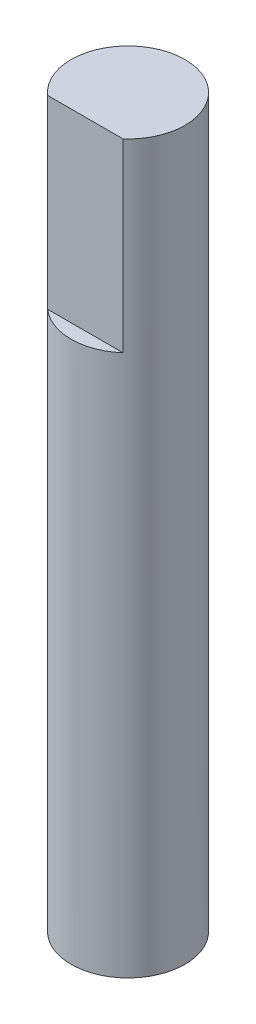
ISO-10303-21;
HEADER;
FILE_DESCRIPTION(('STEP AP214'),'2;1');
FILE_NAME('part.step','',(''),(''),'','','');
FILE_SCHEMA(('AUTOMOTIVE_DESIGN { 1 0 10303 214 1 1 1 1 }'));
ENDSEC;
DATA;
#1=APPLICATION_CONTEXT('core data for automotive mechanical design processes');
#2=APPLICATION_PROTOCOL_DEFINITION('international standard','automotive_design',2000,#1);
#3=PRODUCT_CONTEXT('',#1,'mechanical');
#4=PRODUCT('Part','Part','',(#3));
#5=PRODUCT_RELATED_PRODUCT_CATEGORY('part','',(#4));
#6=PRODUCT_DEFINITION_FORMATION('','',#4);
#7=PRODUCT_DEFINITION_CONTEXT('part definition',#1,'design');
#8=PRODUCT_DEFINITION('design','',#6,#7);
#9=PRODUCT_DEFINITION_SHAPE('','',#8);
#10=(LENGTH_UNIT() NAMED_UNIT(*) SI_UNIT(.MILLI.,.METRE.));
#11=(NAMED_UNIT(*) PLANE_ANGLE_UNIT() SI_UNIT($,.RADIAN.));
#12=(NAMED_UNIT(*) SI_UNIT($,.STERADIAN.) SOLID_ANGLE_UNIT());
#13=UNCERTAINTY_MEASURE_WITH_UNIT(LENGTH_MEASURE(1.E-05),#10,'distance_accuracy_value','');
#14=(GEOMETRIC_REPRESENTATION_CONTEXT(3) GLOBAL_UNCERTAINTY_ASSIGNED_CONTEXT((#13)) GLOBAL_UNIT_ASSIGNED_CONTEXT((#10,
#11,#12)) REPRESENTATION_CONTEXT('',''));
#15=CARTESIAN_POINT('',(0.,0.,0.));
#16=DIRECTION('',(0.,0.,1.));
#17=DIRECTION('',(1.,0.,0.));
#18=AXIS2_PLACEMENT_3D('',#15,#16,#17);
#19=CARTESIAN_POINT('',(0.,13.,0.));
#20=DIRECTION('',(0.,-1.,0.));
#21=DIRECTION('',(0.,0.,-1.));
#22=AXIS2_PLACEMENT_3D('',#19,#20,#21);
#23=CYLINDRICAL_SURFACE('',#22,4.);
#24=DIRECTION('',(0.,-1.,0.));
#25=VECTOR('',#24,1.);
#26=CARTESIAN_POINT('',(2.64575131106459,13.,3.));
#27=LINE('',#26,#25);
#28=CARTESIAN_POINT('',(2.64575131106459,13.,3.));
#29=VERTEX_POINT('',#28);
#30=CARTESIAN_POINT('',(2.64575131106459,0.,3.));
#31=VERTEX_POINT('',#30);
#32=EDGE_CURVE('E41',#29,#31,#27,.T.);
#33=ORIENTED_EDGE('',*,*,#32,.T.);
#34=CARTESIAN_POINT('',(0.,0.,0.));
#35=DIRECTION('',(0.,-1.,0.));
#36=DIRECTION('',(0.,0.,-1.));
#37=AXIS2_PLACEMENT_3D('',#34,#35,#36);
#38=CIRCLE('',#37,4.);
#39=CARTESIAN_POINT('',(-2.64575131106459,0.,3.));
#40=VERTEX_POINT('',#39);
#41=EDGE_CURVE('E58',#31,#40,#38,.T.);
#42=ORIENTED_EDGE('',*,*,#41,.T.);
#43=DIRECTION('',(0.,-1.,0.));
#44=VECTOR('',#43,1.);
#45=CARTESIAN_POINT('',(-2.64575131106459,13.,3.));
#46=LINE('',#45,#44);
#47=CARTESIAN_POINT('',(-2.64575131106459,13.,3.));
#48=VERTEX_POINT('',#47);
#49=EDGE_CURVE('E11',#48,#40,#46,.T.);
#50=ORIENTED_EDGE('',*,*,#49,.F.);
#51=CARTESIAN_POINT('',(0.,13.,0.));
#52=DIRECTION('',(0.,1.,0.));
#53=DIRECTION('',(0.,0.,-1.));
#54=AXIS2_PLACEMENT_3D('',#51,#52,#53);
#55=CIRCLE('',#54,4.);
#56=EDGE_CURVE('E68',#29,#48,#55,.T.);
#57=ORIENTED_EDGE('',*,*,#56,.F.);
#58=EDGE_LOOP('',(#33,#42,#50,#57));
#59=FACE_BOUND('',#58,.T.);
#60=CARTESIAN_POINT('',(0.,-38.,0.));
#61=DIRECTION('',(0.,-1.,0.));
#62=DIRECTION('',(0.,0.,-1.));
#63=AXIS2_PLACEMENT_3D('',#60,#61,#62);
#64=CIRCLE('',#63,4.);
#65=CARTESIAN_POINT('',(0.,-38.,-4.));
#66=VERTEX_POINT('',#65);
#67=EDGE_CURVE('E63',#66,#66,#64,.T.);
#68=ORIENTED_EDGE('',*,*,#67,.F.);
#69=EDGE_LOOP('',(#68));
#70=FACE_BOUND('',#69,.T.);
#71=ADVANCED_FACE('F33',(#59,#70),#23,.T.);
#72=CARTESIAN_POINT('',(-2.64575131106459,13.,3.));
#73=DIRECTION('',(0.,0.,-1.));
#74=DIRECTION('',(-1.,0.,0.));
#75=AXIS2_PLACEMENT_3D('',#72,#73,#74);
#76=PLANE('',#75);
#77=DIRECTION('',(1.,0.,0.));
#78=VECTOR('',#77,1.);
#79=CARTESIAN_POINT('',(-2.64575131106459,0.,3.));
#80=LINE('',#79,#78);
#81=EDGE_CURVE('E56',#40,#31,#80,.T.);
#82=ORIENTED_EDGE('',*,*,#81,.T.);
#83=ORIENTED_EDGE('',*,*,#32,.F.);
#84=DIRECTION('',(1.,0.,0.));
#85=VECTOR('',#84,1.);
#86=CARTESIAN_POINT('',(-2.64575131106459,13.,3.));
#87=LINE('',#86,#85);
#88=EDGE_CURVE('E47',#48,#29,#87,.T.);
#89=ORIENTED_EDGE('',*,*,#88,.F.);
#90=ORIENTED_EDGE('',*,*,#49,.T.);
#91=EDGE_LOOP('',(#82,#83,#89,#90));
#92=FACE_BOUND('',#91,.T.);
#93=ADVANCED_FACE('F66',(#92),#76,.F.);
#94=CARTESIAN_POINT('',(0.,13.,0.));
#95=DIRECTION('',(0.,-1.,0.));
#96=DIRECTION('',(0.,0.,-1.));
#97=AXIS2_PLACEMENT_3D('',#94,#95,#96);
#98=PLANE('',#97);
#99=ORIENTED_EDGE('',*,*,#56,.T.);
#100=ORIENTED_EDGE('',*,*,#88,.T.);
#101=EDGE_LOOP('',(#99,#100));
#102=FACE_BOUND('',#101,.T.);
#103=ADVANCED_FACE('F82',(#102),#98,.F.);
#104=CARTESIAN_POINT('',(0.,-38.,0.));
#105=DIRECTION('',(0.,-1.,0.));
#106=DIRECTION('',(0.,0.,-1.));
#107=AXIS2_PLACEMENT_3D('',#104,#105,#106);
#108=PLANE('',#107);
#109=ORIENTED_EDGE('',*,*,#67,.T.);
#110=EDGE_LOOP('',(#109));
#111=FACE_BOUND('',#110,.T.);
#112=ADVANCED_FACE('F77',(#111),#108,.T.);
#113=CARTESIAN_POINT('',(0.,0.,0.));
#114=DIRECTION('',(0.,-1.,0.));
#115=DIRECTION('',(0.,0.,-1.));
#116=AXIS2_PLACEMENT_3D('',#113,#114,#115);
#117=PLANE('',#116);
#118=ORIENTED_EDGE('',*,*,#81,.F.);
#119=ORIENTED_EDGE('',*,*,#41,.F.);
#120=EDGE_LOOP('',(#118,#119));
#121=FACE_BOUND('',#120,.T.);
#122=ADVANCED_FACE('F59',(#121),#117,.F.);
#123=CLOSED_SHELL('',(#71,#93,#103,#112,#122));
#124=MANIFOLD_SOLID_BREP('B2',#123);
#125=ADVANCED_BREP_SHAPE_REPRESENTATION('',(#18,#124),#14);
#126=SHAPE_DEFINITION_REPRESENTATION(#9,#125);
ENDSEC;
END-ISO-10303-21;
